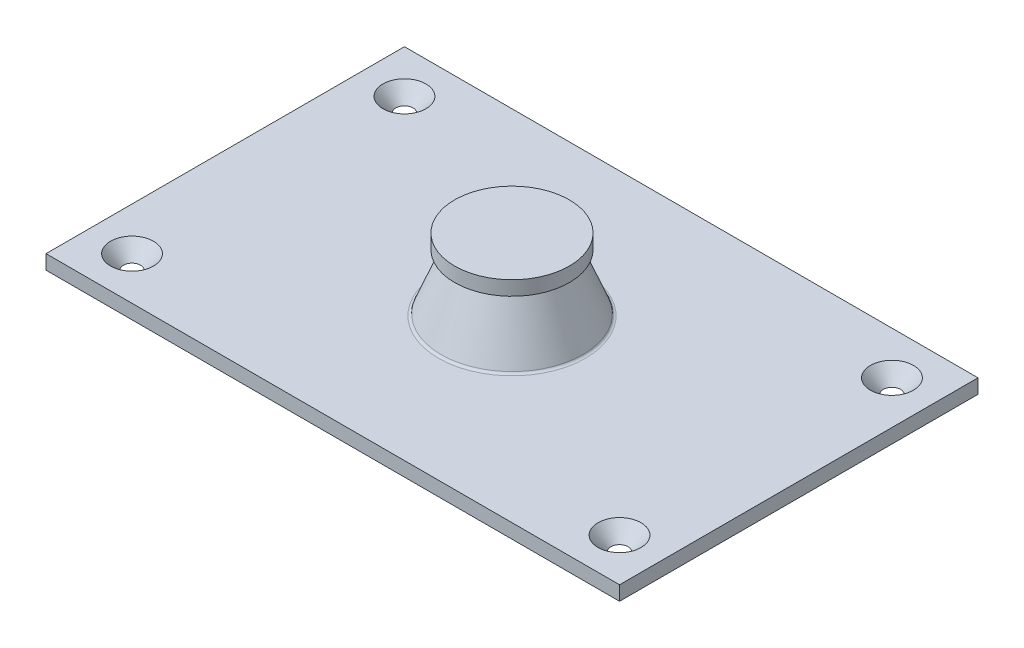
ISO-10303-21;
HEADER;
FILE_DESCRIPTION(('STEP AP214'),'2;1');
FILE_NAME('part.step','',(''),(''),'','','');
FILE_SCHEMA(('AUTOMOTIVE_DESIGN { 1 0 10303 214 1 1 1 1 }'));
ENDSEC;
DATA;
#1=APPLICATION_CONTEXT('core data for automotive mechanical design processes');
#2=APPLICATION_PROTOCOL_DEFINITION('international standard','automotive_design',2000,#1);
#3=PRODUCT_CONTEXT('',#1,'mechanical');
#4=PRODUCT('Part','Part','',(#3));
#5=PRODUCT_RELATED_PRODUCT_CATEGORY('part','',(#4));
#6=PRODUCT_DEFINITION_FORMATION('','',#4);
#7=PRODUCT_DEFINITION_CONTEXT('part definition',#1,'design');
#8=PRODUCT_DEFINITION('design','',#6,#7);
#9=PRODUCT_DEFINITION_SHAPE('','',#8);
#10=(LENGTH_UNIT() NAMED_UNIT(*) SI_UNIT(.MILLI.,.METRE.));
#11=(NAMED_UNIT(*) PLANE_ANGLE_UNIT() SI_UNIT($,.RADIAN.));
#12=(NAMED_UNIT(*) SI_UNIT($,.STERADIAN.) SOLID_ANGLE_UNIT());
#13=UNCERTAINTY_MEASURE_WITH_UNIT(LENGTH_MEASURE(1.E-05),#10,'distance_accuracy_value','');
#14=(GEOMETRIC_REPRESENTATION_CONTEXT(3) GLOBAL_UNCERTAINTY_ASSIGNED_CONTEXT((#13)) GLOBAL_UNIT_ASSIGNED_CONTEXT((#10,
#11,#12)) REPRESENTATION_CONTEXT('',''));
#15=CARTESIAN_POINT('',(0.,0.,0.));
#16=DIRECTION('',(0.,0.,1.));
#17=DIRECTION('',(1.,0.,0.));
#18=AXIS2_PLACEMENT_3D('',#15,#16,#17);
#19=CARTESIAN_POINT('',(0.,7.62,0.));
#20=DIRECTION('',(0.,-1.,0.));
#21=DIRECTION('',(0.,0.,-1.));
#22=AXIS2_PLACEMENT_3D('',#19,#20,#21);
#23=CONICAL_SURFACE('',#22,3.80999999999998,0.380506377112362);
#24=CARTESIAN_POINT('',(0.,1.42966676820606,0.));
#25=DIRECTION('',(0.,1.,0.));
#26=DIRECTION('',(0.,0.,1.));
#27=AXIS2_PLACEMENT_3D('',#24,#25,#26);
#28=CIRCLE('',#27,6.28613329271754);
#29=CARTESIAN_POINT('',(0.,1.42966676820606,6.28613329271754));
#30=VERTEX_POINT('',#29);
#31=EDGE_CURVE('E11',#30,#30,#28,.T.);
#32=ORIENTED_EDGE('',*,*,#31,.T.);
#33=EDGE_LOOP('',(#32));
#34=FACE_BOUND('',#33,.T.);
#35=CARTESIAN_POINT('',(0.,6.35,0.));
#36=DIRECTION('',(0.,1.,0.));
#37=DIRECTION('',(0.,0.,1.));
#38=AXIS2_PLACEMENT_3D('',#35,#36,#37);
#39=CIRCLE('',#38,4.31799999999998);
#40=CARTESIAN_POINT('',(0.,6.35,4.31799999999998));
#41=VERTEX_POINT('',#40);
#42=EDGE_CURVE('E43',#41,#41,#39,.F.);
#43=ORIENTED_EDGE('',*,*,#42,.T.);
#44=EDGE_LOOP('',(#43));
#45=FACE_BOUND('',#44,.T.);
#46=ADVANCED_FACE('F39',(#34,#45),#23,.T.);
#47=CARTESIAN_POINT('',(25.4,1.27,15.875));
#48=DIRECTION('',(-1.,0.,0.));
#49=DIRECTION('',(0.,0.,1.));
#50=AXIS2_PLACEMENT_3D('',#47,#48,#49);
#51=PLANE('',#50);
#52=DIRECTION('',(0.,0.,-1.));
#53=VECTOR('',#52,1.);
#54=CARTESIAN_POINT('',(25.4,0.,15.875));
#55=LINE('',#54,#53);
#56=CARTESIAN_POINT('',(25.4,0.,15.875));
#57=VERTEX_POINT('',#56);
#58=CARTESIAN_POINT('',(25.4,0.,-15.875));
#59=VERTEX_POINT('',#58);
#60=EDGE_CURVE('E113',#57,#59,#55,.T.);
#61=ORIENTED_EDGE('',*,*,#60,.T.);
#62=DIRECTION('',(0.,-1.,0.));
#63=VECTOR('',#62,1.);
#64=CARTESIAN_POINT('',(25.4,1.27,-15.875));
#65=LINE('',#64,#63);
#66=CARTESIAN_POINT('',(25.4,1.27,-15.875));
#67=VERTEX_POINT('',#66);
#68=EDGE_CURVE('E102',#67,#59,#65,.T.);
#69=ORIENTED_EDGE('',*,*,#68,.F.);
#70=DIRECTION('',(0.,0.,-1.));
#71=VECTOR('',#70,1.);
#72=CARTESIAN_POINT('',(25.4,1.27,15.875));
#73=LINE('',#72,#71);
#74=CARTESIAN_POINT('',(25.4,1.27,15.875));
#75=VERTEX_POINT('',#74);
#76=EDGE_CURVE('E94',#75,#67,#73,.T.);
#77=ORIENTED_EDGE('',*,*,#76,.F.);
#78=DIRECTION('',(0.,-1.,0.));
#79=VECTOR('',#78,1.);
#80=CARTESIAN_POINT('',(25.4,1.27,15.875));
#81=LINE('',#80,#79);
#82=EDGE_CURVE('E109',#75,#57,#81,.T.);
#83=ORIENTED_EDGE('',*,*,#82,.T.);
#84=EDGE_LOOP('',(#61,#69,#77,#83));
#85=FACE_BOUND('',#84,.T.);
#86=ADVANCED_FACE('F150',(#85),#51,.F.);
#87=CARTESIAN_POINT('',(-25.4,1.27,-15.875));
#88=DIRECTION('',(0.,0.,1.));
#89=DIRECTION('',(1.,0.,0.));
#90=AXIS2_PLACEMENT_3D('',#87,#88,#89);
#91=PLANE('',#90);
#92=DIRECTION('',(-1.,0.,0.));
#93=VECTOR('',#92,1.);
#94=CARTESIAN_POINT('',(-25.4,0.,-15.875));
#95=LINE('',#94,#93);
#96=CARTESIAN_POINT('',(-25.4,0.,-15.875));
#97=VERTEX_POINT('',#96);
#98=EDGE_CURVE('E100',#59,#97,#95,.T.);
#99=ORIENTED_EDGE('',*,*,#98,.T.);
#100=DIRECTION('',(0.,-1.,0.));
#101=VECTOR('',#100,1.);
#102=CARTESIAN_POINT('',(-25.4,1.27,-15.875));
#103=LINE('',#102,#101);
#104=CARTESIAN_POINT('',(-25.4,1.27,-15.875));
#105=VERTEX_POINT('',#104);
#106=EDGE_CURVE('E98',#105,#97,#103,.T.);
#107=ORIENTED_EDGE('',*,*,#106,.F.);
#108=DIRECTION('',(-1.,0.,0.));
#109=VECTOR('',#108,1.);
#110=CARTESIAN_POINT('',(-25.4,1.27,-15.875));
#111=LINE('',#110,#109);
#112=EDGE_CURVE('E89',#67,#105,#111,.T.);
#113=ORIENTED_EDGE('',*,*,#112,.F.);
#114=ORIENTED_EDGE('',*,*,#68,.T.);
#115=EDGE_LOOP('',(#99,#107,#113,#114));
#116=FACE_BOUND('',#115,.T.);
#117=ADVANCED_FACE('F99',(#116),#91,.F.);
#118=CARTESIAN_POINT('',(-25.4,1.27,15.875));
#119=DIRECTION('',(1.,0.,0.));
#120=DIRECTION('',(0.,0.,-1.));
#121=AXIS2_PLACEMENT_3D('',#118,#119,#120);
#122=PLANE('',#121);
#123=DIRECTION('',(0.,0.,1.));
#124=VECTOR('',#123,1.);
#125=CARTESIAN_POINT('',(-25.4,0.,15.875));
#126=LINE('',#125,#124);
#127=CARTESIAN_POINT('',(-25.4,0.,15.875));
#128=VERTEX_POINT('',#127);
#129=EDGE_CURVE('E75',#97,#128,#126,.T.);
#130=ORIENTED_EDGE('',*,*,#129,.T.);
#131=DIRECTION('',(0.,-1.,0.));
#132=VECTOR('',#131,1.);
#133=CARTESIAN_POINT('',(-25.4,1.27,15.875));
#134=LINE('',#133,#132);
#135=CARTESIAN_POINT('',(-25.4,1.27,15.875));
#136=VERTEX_POINT('',#135);
#137=EDGE_CURVE('E103',#136,#128,#134,.T.);
#138=ORIENTED_EDGE('',*,*,#137,.F.);
#139=DIRECTION('',(0.,0.,1.));
#140=VECTOR('',#139,1.);
#141=CARTESIAN_POINT('',(-25.4,1.27,15.875));
#142=LINE('',#141,#140);
#143=EDGE_CURVE('E92',#105,#136,#142,.T.);
#144=ORIENTED_EDGE('',*,*,#143,.F.);
#145=ORIENTED_EDGE('',*,*,#106,.T.);
#146=EDGE_LOOP('',(#130,#138,#144,#145));
#147=FACE_BOUND('',#146,.T.);
#148=ADVANCED_FACE('F105',(#147),#122,.F.);
#149=CARTESIAN_POINT('',(-25.4,1.27,15.875));
#150=DIRECTION('',(0.,0.,-1.));
#151=DIRECTION('',(-1.,0.,0.));
#152=AXIS2_PLACEMENT_3D('',#149,#150,#151);
#153=PLANE('',#152);
#154=DIRECTION('',(1.,0.,0.));
#155=VECTOR('',#154,1.);
#156=CARTESIAN_POINT('',(-25.4,0.,15.875));
#157=LINE('',#156,#155);
#158=EDGE_CURVE('E81',#128,#57,#157,.T.);
#159=ORIENTED_EDGE('',*,*,#158,.T.);
#160=ORIENTED_EDGE('',*,*,#82,.F.);
#161=DIRECTION('',(1.,0.,0.));
#162=VECTOR('',#161,1.);
#163=CARTESIAN_POINT('',(-25.4,1.27,15.875));
#164=LINE('',#163,#162);
#165=EDGE_CURVE('E58',#136,#75,#164,.T.);
#166=ORIENTED_EDGE('',*,*,#165,.F.);
#167=ORIENTED_EDGE('',*,*,#137,.T.);
#168=EDGE_LOOP('',(#159,#160,#166,#167));
#169=FACE_BOUND('',#168,.T.);
#170=ADVANCED_FACE('F165',(#169),#153,.F.);
#171=CARTESIAN_POINT('',(0.,1.27,0.));
#172=DIRECTION('',(0.,-1.,0.));
#173=DIRECTION('',(0.,0.,-1.));
#174=AXIS2_PLACEMENT_3D('',#171,#172,#173);
#175=PLANE('',#174);
#176=CARTESIAN_POINT('',(-21.59,1.27,12.065));
#177=DIRECTION('',(0.,-1.,0.));
#178=DIRECTION('',(0.,0.,1.));
#179=AXIS2_PLACEMENT_3D('',#176,#177,#178);
#180=CIRCLE('',#179,1.905);
#181=CARTESIAN_POINT('',(-21.59,1.27,13.97));
#182=VERTEX_POINT('',#181);
#183=EDGE_CURVE('E206',#182,#182,#180,.T.);
#184=ORIENTED_EDGE('',*,*,#183,.T.);
#185=EDGE_LOOP('',(#184));
#186=FACE_BOUND('',#185,.T.);
#187=CARTESIAN_POINT('',(-21.59,1.27,-12.065));
#188=DIRECTION('',(0.,1.,0.));
#189=DIRECTION('',(0.,0.,-1.));
#190=AXIS2_PLACEMENT_3D('',#187,#188,#189);
#191=CIRCLE('',#190,1.905);
#192=CARTESIAN_POINT('',(-21.59,1.27,-13.97));
#193=VERTEX_POINT('',#192);
#194=EDGE_CURVE('E217',#193,#193,#191,.T.);
#195=ORIENTED_EDGE('',*,*,#194,.F.);
#196=EDGE_LOOP('',(#195));
#197=FACE_BOUND('',#196,.T.);
#198=CARTESIAN_POINT('',(21.59,1.27,-12.065));
#199=DIRECTION('',(0.,-1.,0.));
#200=DIRECTION('',(0.,0.,-1.));
#201=AXIS2_PLACEMENT_3D('',#198,#199,#200);
#202=CIRCLE('',#201,1.905);
#203=CARTESIAN_POINT('',(21.59,1.27,-13.97));
#204=VERTEX_POINT('',#203);
#205=EDGE_CURVE('E225',#204,#204,#202,.T.);
#206=ORIENTED_EDGE('',*,*,#205,.T.);
#207=EDGE_LOOP('',(#206));
#208=FACE_BOUND('',#207,.T.);
#209=CARTESIAN_POINT('',(21.59,1.27,12.065));
#210=DIRECTION('',(0.,1.,0.));
#211=DIRECTION('',(0.,0.,1.));
#212=AXIS2_PLACEMENT_3D('',#209,#210,#211);
#213=CIRCLE('',#212,1.905);
#214=CARTESIAN_POINT('',(21.59,1.27,13.97));
#215=VERTEX_POINT('',#214);
#216=EDGE_CURVE('E233',#215,#215,#213,.T.);
#217=ORIENTED_EDGE('',*,*,#216,.F.);
#218=EDGE_LOOP('',(#217));
#219=FACE_BOUND('',#218,.T.);
#220=CARTESIAN_POINT('',(0.,1.27,0.));
#221=DIRECTION('',(0.,-1.,0.));
#222=DIRECTION('',(0.,0.,-1.));
#223=AXIS2_PLACEMENT_3D('',#220,#221,#222);
#224=CIRCLE('',#223,6.52196637220239);
#225=CARTESIAN_POINT('',(0.,1.27,-6.52196637220239));
#226=VERTEX_POINT('',#225);
#227=EDGE_CURVE('E50',#226,#226,#224,.T.);
#228=ORIENTED_EDGE('',*,*,#227,.T.);
#229=EDGE_LOOP('',(#228));
#230=FACE_BOUND('',#229,.T.);
#231=ORIENTED_EDGE('',*,*,#76,.T.);
#232=ORIENTED_EDGE('',*,*,#112,.T.);
#233=ORIENTED_EDGE('',*,*,#143,.T.);
#234=ORIENTED_EDGE('',*,*,#165,.T.);
#235=EDGE_LOOP('',(#231,#232,#233,#234));
#236=FACE_BOUND('',#235,.T.);
#237=ADVANCED_FACE('F90',(#186,#197,#208,#219,#230,#236),#175,.F.);
#238=CARTESIAN_POINT('',(0.,0.,0.));
#239=DIRECTION('',(0.,-1.,0.));
#240=DIRECTION('',(0.,0.,-1.));
#241=AXIS2_PLACEMENT_3D('',#238,#239,#240);
#242=PLANE('',#241);
#243=CARTESIAN_POINT('',(-21.59,0.,12.065));
#244=DIRECTION('',(0.,-1.,0.));
#245=DIRECTION('',(0.,0.,1.));
#246=AXIS2_PLACEMENT_3D('',#243,#244,#245);
#247=CIRCLE('',#246,0.761999999999999);
#248=CARTESIAN_POINT('',(-21.59,0.,12.827));
#249=VERTEX_POINT('',#248);
#250=EDGE_CURVE('E213',#249,#249,#247,.T.);
#251=ORIENTED_EDGE('',*,*,#250,.F.);
#252=EDGE_LOOP('',(#251));
#253=FACE_BOUND('',#252,.T.);
#254=CARTESIAN_POINT('',(-21.59,0.,-12.065));
#255=DIRECTION('',(0.,1.,0.));
#256=DIRECTION('',(0.,0.,-1.));
#257=AXIS2_PLACEMENT_3D('',#254,#255,#256);
#258=CIRCLE('',#257,0.761999999999999);
#259=CARTESIAN_POINT('',(-21.59,0.,-12.827));
#260=VERTEX_POINT('',#259);
#261=EDGE_CURVE('E221',#260,#260,#258,.T.);
#262=ORIENTED_EDGE('',*,*,#261,.T.);
#263=EDGE_LOOP('',(#262));
#264=FACE_BOUND('',#263,.T.);
#265=CARTESIAN_POINT('',(21.59,0.,-12.065));
#266=DIRECTION('',(0.,-1.,0.));
#267=DIRECTION('',(0.,0.,-1.));
#268=AXIS2_PLACEMENT_3D('',#265,#266,#267);
#269=CIRCLE('',#268,0.761999999999999);
#270=CARTESIAN_POINT('',(21.59,0.,-12.827));
#271=VERTEX_POINT('',#270);
#272=EDGE_CURVE('E229',#271,#271,#269,.T.);
#273=ORIENTED_EDGE('',*,*,#272,.F.);
#274=EDGE_LOOP('',(#273));
#275=FACE_BOUND('',#274,.T.);
#276=CARTESIAN_POINT('',(21.59,0.,12.065));
#277=DIRECTION('',(0.,1.,0.));
#278=DIRECTION('',(0.,0.,1.));
#279=AXIS2_PLACEMENT_3D('',#276,#277,#278);
#280=CIRCLE('',#279,0.761999999999999);
#281=CARTESIAN_POINT('',(21.59,0.,12.827));
#282=VERTEX_POINT('',#281);
#283=EDGE_CURVE('E117',#282,#282,#280,.T.);
#284=ORIENTED_EDGE('',*,*,#283,.T.);
#285=EDGE_LOOP('',(#284));
#286=FACE_BOUND('',#285,.T.);
#287=ORIENTED_EDGE('',*,*,#60,.F.);
#288=ORIENTED_EDGE('',*,*,#158,.F.);
#289=ORIENTED_EDGE('',*,*,#129,.F.);
#290=ORIENTED_EDGE('',*,*,#98,.F.);
#291=EDGE_LOOP('',(#287,#288,#289,#290));
#292=FACE_BOUND('',#291,.T.);
#293=ADVANCED_FACE('F137',(#253,#264,#275,#286,#292),#242,.T.);
#294=CARTESIAN_POINT('',(0.,1.524,0.));
#295=DIRECTION('',(0.,-1.,0.));
#296=DIRECTION('',(0.,0.,-1.));
#297=AXIS2_PLACEMENT_3D('',#294,#295,#296);
#298=TOROIDAL_SURFACE('',#297,6.52196637220239,0.254);
#299=ORIENTED_EDGE('',*,*,#31,.F.);
#300=EDGE_LOOP('',(#299));
#301=FACE_BOUND('',#300,.T.);
#302=ORIENTED_EDGE('',*,*,#227,.F.);
#303=EDGE_LOOP('',(#302));
#304=FACE_BOUND('',#303,.T.);
#305=ADVANCED_FACE('F41',(#301,#304),#298,.F.);
#306=CARTESIAN_POINT('',(21.59,1.27,12.065));
#307=DIRECTION('',(0.,1.,0.));
#308=DIRECTION('',(0.,0.,1.));
#309=AXIS2_PLACEMENT_3D('',#306,#307,#308);
#310=CONICAL_SURFACE('',#309,1.905,0.732815101786507);
#311=ORIENTED_EDGE('',*,*,#283,.F.);
#312=EDGE_LOOP('',(#311));
#313=FACE_BOUND('',#312,.T.);
#314=ORIENTED_EDGE('',*,*,#216,.T.);
#315=EDGE_LOOP('',(#314));
#316=FACE_BOUND('',#315,.T.);
#317=ADVANCED_FACE('F136',(#313,#316),#310,.F.);
#318=CARTESIAN_POINT('',(21.59,1.27,-12.065));
#319=DIRECTION('',(0.,1.,0.));
#320=DIRECTION('',(0.,0.,-1.));
#321=AXIS2_PLACEMENT_3D('',#318,#319,#320);
#322=CONICAL_SURFACE('',#321,1.905,0.732815101786507);
#323=ORIENTED_EDGE('',*,*,#272,.T.);
#324=EDGE_LOOP('',(#323));
#325=FACE_BOUND('',#324,.T.);
#326=ORIENTED_EDGE('',*,*,#205,.F.);
#327=EDGE_LOOP('',(#326));
#328=FACE_BOUND('',#327,.T.);
#329=ADVANCED_FACE('F143',(#325,#328),#322,.F.);
#330=CARTESIAN_POINT('',(-21.59,1.27,-12.065));
#331=DIRECTION('',(0.,1.,0.));
#332=DIRECTION('',(0.,0.,-1.));
#333=AXIS2_PLACEMENT_3D('',#330,#331,#332);
#334=CONICAL_SURFACE('',#333,1.905,0.732815101786507);
#335=ORIENTED_EDGE('',*,*,#261,.F.);
#336=EDGE_LOOP('',(#335));
#337=FACE_BOUND('',#336,.T.);
#338=ORIENTED_EDGE('',*,*,#194,.T.);
#339=EDGE_LOOP('',(#338));
#340=FACE_BOUND('',#339,.T.);
#341=ADVANCED_FACE('F178',(#337,#340),#334,.F.);
#342=CARTESIAN_POINT('',(-21.59,1.27,12.065));
#343=DIRECTION('',(0.,1.,0.));
#344=DIRECTION('',(0.,0.,1.));
#345=AXIS2_PLACEMENT_3D('',#342,#343,#344);
#346=CONICAL_SURFACE('',#345,1.905,0.732815101786507);
#347=ORIENTED_EDGE('',*,*,#250,.T.);
#348=EDGE_LOOP('',(#347));
#349=FACE_BOUND('',#348,.T.);
#350=ORIENTED_EDGE('',*,*,#183,.F.);
#351=EDGE_LOOP('',(#350));
#352=FACE_BOUND('',#351,.T.);
#353=ADVANCED_FACE('F182',(#349,#352),#346,.F.);
#354=CARTESIAN_POINT('',(0.,6.35,0.));
#355=DIRECTION('',(0.,1.,0.));
#356=DIRECTION('',(0.,0.,1.));
#357=AXIS2_PLACEMENT_3D('',#354,#355,#356);
#358=CYLINDRICAL_SURFACE('',#357,5.08);
#359=CARTESIAN_POINT('',(0.,6.35,0.));
#360=DIRECTION('',(0.,1.,0.));
#361=DIRECTION('',(0.,0.,1.));
#362=AXIS2_PLACEMENT_3D('',#359,#360,#361);
#363=CIRCLE('',#362,5.08);
#364=CARTESIAN_POINT('',(0.,6.35,5.08));
#365=VERTEX_POINT('',#364);
#366=EDGE_CURVE('E200',#365,#365,#363,.T.);
#367=ORIENTED_EDGE('',*,*,#366,.T.);
#368=EDGE_LOOP('',(#367));
#369=FACE_BOUND('',#368,.T.);
#370=CARTESIAN_POINT('',(0.,7.62,0.));
#371=DIRECTION('',(0.,1.,0.));
#372=DIRECTION('',(0.,0.,1.));
#373=AXIS2_PLACEMENT_3D('',#370,#371,#372);
#374=CIRCLE('',#373,5.08);
#375=CARTESIAN_POINT('',(0.,7.62,5.08));
#376=VERTEX_POINT('',#375);
#377=EDGE_CURVE('E202',#376,#376,#374,.T.);
#378=ORIENTED_EDGE('',*,*,#377,.F.);
#379=EDGE_LOOP('',(#378));
#380=FACE_BOUND('',#379,.T.);
#381=ADVANCED_FACE('F186',(#369,#380),#358,.T.);
#382=CARTESIAN_POINT('',(0.,6.35,0.));
#383=DIRECTION('',(0.,1.,0.));
#384=DIRECTION('',(0.,0.,1.));
#385=AXIS2_PLACEMENT_3D('',#382,#383,#384);
#386=PLANE('',#385);
#387=ORIENTED_EDGE('',*,*,#42,.F.);
#388=EDGE_LOOP('',(#387));
#389=FACE_BOUND('',#388,.T.);
#390=ORIENTED_EDGE('',*,*,#366,.F.);
#391=EDGE_LOOP('',(#390));
#392=FACE_BOUND('',#391,.T.);
#393=ADVANCED_FACE('F173',(#389,#392),#386,.F.);
#394=CARTESIAN_POINT('',(0.,7.62,0.));
#395=DIRECTION('',(0.,1.,0.));
#396=DIRECTION('',(0.,0.,1.));
#397=AXIS2_PLACEMENT_3D('',#394,#395,#396);
#398=PLANE('',#397);
#399=ORIENTED_EDGE('',*,*,#377,.T.);
#400=EDGE_LOOP('',(#399));
#401=FACE_BOUND('',#400,.T.);
#402=ADVANCED_FACE('F171',(#401),#398,.T.);
#403=CLOSED_SHELL('',(#46,#86,#117,#148,#170,#237,#293,#305,#317,#329,#341,#353,#381,#393,#402));
#404=MANIFOLD_SOLID_BREP('B2',#403);
#405=ADVANCED_BREP_SHAPE_REPRESENTATION('',(#18,#404),#14);
#406=SHAPE_DEFINITION_REPRESENTATION(#9,#405);
ENDSEC;
END-ISO-10303-21;
